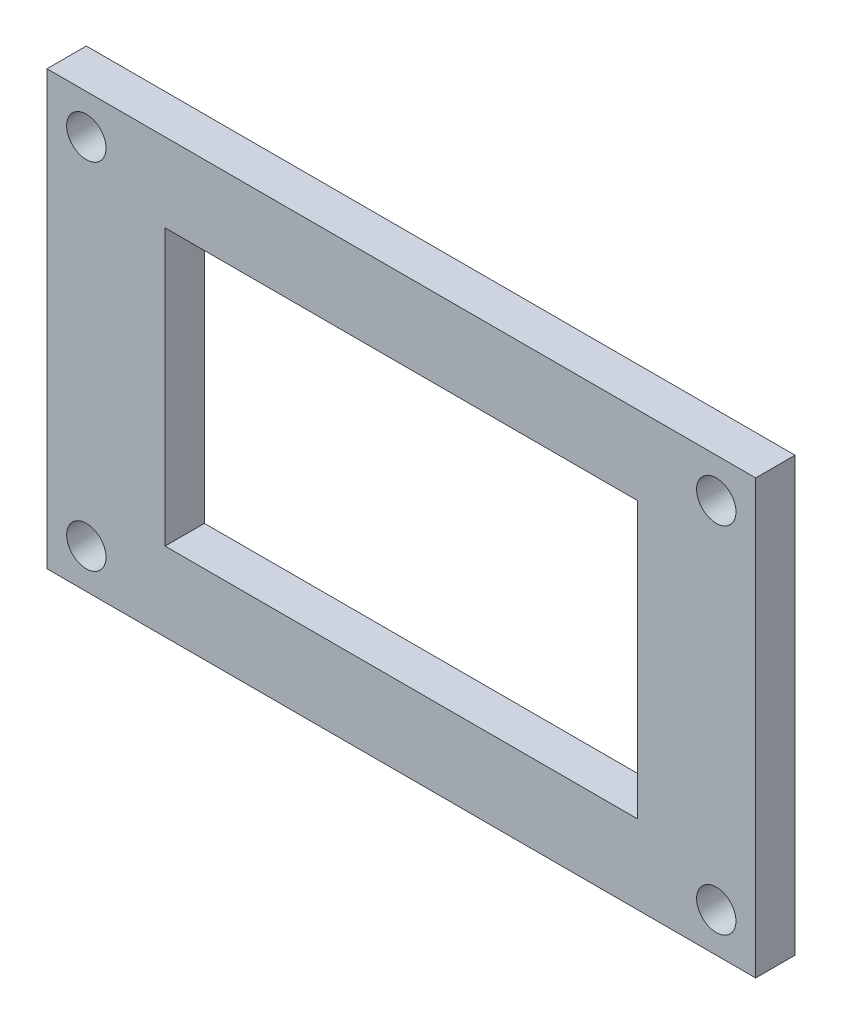
ISO-10303-21;
HEADER;
FILE_DESCRIPTION(('STEP AP214'),'2;1');
FILE_NAME('part.step','',(''),(''),'','','');
FILE_SCHEMA(('AUTOMOTIVE_DESIGN { 1 0 10303 214 1 1 1 1 }'));
ENDSEC;
DATA;
#1=APPLICATION_CONTEXT('core data for automotive mechanical design processes');
#2=APPLICATION_PROTOCOL_DEFINITION('international standard','automotive_design',2000,#1);
#3=PRODUCT_CONTEXT('',#1,'mechanical');
#4=PRODUCT('Part','Part','',(#3));
#5=PRODUCT_RELATED_PRODUCT_CATEGORY('part','',(#4));
#6=PRODUCT_DEFINITION_FORMATION('','',#4);
#7=PRODUCT_DEFINITION_CONTEXT('part definition',#1,'design');
#8=PRODUCT_DEFINITION('design','',#6,#7);
#9=PRODUCT_DEFINITION_SHAPE('','',#8);
#10=(LENGTH_UNIT() NAMED_UNIT(*) SI_UNIT(.MILLI.,.METRE.));
#11=(NAMED_UNIT(*) PLANE_ANGLE_UNIT() SI_UNIT($,.RADIAN.));
#12=(NAMED_UNIT(*) SI_UNIT($,.STERADIAN.) SOLID_ANGLE_UNIT());
#13=UNCERTAINTY_MEASURE_WITH_UNIT(LENGTH_MEASURE(1.E-05),#10,'distance_accuracy_value','');
#14=(GEOMETRIC_REPRESENTATION_CONTEXT(3) GLOBAL_UNCERTAINTY_ASSIGNED_CONTEXT((#13)) GLOBAL_UNIT_ASSIGNED_CONTEXT((#10,
#11,#12)) REPRESENTATION_CONTEXT('',''));
#15=CARTESIAN_POINT('',(0.,0.,0.));
#16=DIRECTION('',(0.,0.,1.));
#17=DIRECTION('',(1.,0.,0.));
#18=AXIS2_PLACEMENT_3D('',#15,#16,#17);
#19=CARTESIAN_POINT('',(0.,0.,3.175));
#20=DIRECTION('',(0.,0.,-1.));
#21=DIRECTION('',(-1.,0.,0.));
#22=AXIS2_PLACEMENT_3D('',#19,#20,#21);
#23=PLANE('',#22);
#24=CARTESIAN_POINT('',(-25.4,-14.2875,3.175));
#25=DIRECTION('',(0.,0.,-1.));
#26=DIRECTION('',(-1.,0.,0.));
#27=AXIS2_PLACEMENT_3D('',#24,#25,#26);
#28=CIRCLE('',#27,1.5875);
#29=CARTESIAN_POINT('',(-26.9875,-14.2875,3.175));
#30=VERTEX_POINT('',#29);
#31=EDGE_CURVE('E251',#30,#30,#28,.T.);
#32=ORIENTED_EDGE('',*,*,#31,.T.);
#33=EDGE_LOOP('',(#32));
#34=FACE_BOUND('',#33,.T.);
#35=CARTESIAN_POINT('',(-25.4,14.2875,3.175));
#36=DIRECTION('',(0.,0.,-1.));
#37=DIRECTION('',(-1.,0.,0.));
#38=AXIS2_PLACEMENT_3D('',#35,#36,#37);
#39=CIRCLE('',#38,1.5875);
#40=CARTESIAN_POINT('',(-26.9875,14.2875,3.175));
#41=VERTEX_POINT('',#40);
#42=EDGE_CURVE('E241',#41,#41,#39,.T.);
#43=ORIENTED_EDGE('',*,*,#42,.T.);
#44=EDGE_LOOP('',(#43));
#45=FACE_BOUND('',#44,.T.);
#46=CARTESIAN_POINT('',(25.4,14.2875,3.175));
#47=DIRECTION('',(0.,0.,-1.));
#48=DIRECTION('',(-1.,0.,0.));
#49=AXIS2_PLACEMENT_3D('',#46,#47,#48);
#50=CIRCLE('',#49,1.5875);
#51=CARTESIAN_POINT('',(23.8125,14.2875,3.175));
#52=VERTEX_POINT('',#51);
#53=EDGE_CURVE('E236',#52,#52,#50,.T.);
#54=ORIENTED_EDGE('',*,*,#53,.T.);
#55=EDGE_LOOP('',(#54));
#56=FACE_BOUND('',#55,.T.);
#57=CARTESIAN_POINT('',(25.4,-14.2875,3.175));
#58=DIRECTION('',(0.,0.,-1.));
#59=DIRECTION('',(-1.,0.,0.));
#60=AXIS2_PLACEMENT_3D('',#57,#58,#59);
#61=CIRCLE('',#60,1.5875);
#62=CARTESIAN_POINT('',(23.8125,-14.2875,3.175));
#63=VERTEX_POINT('',#62);
#64=EDGE_CURVE('E126',#63,#63,#61,.T.);
#65=ORIENTED_EDGE('',*,*,#64,.T.);
#66=EDGE_LOOP('',(#65));
#67=FACE_BOUND('',#66,.T.);
#68=DIRECTION('',(0.,1.,0.));
#69=VECTOR('',#68,1.);
#70=CARTESIAN_POINT('',(28.575,-17.4625,3.175));
#71=LINE('',#70,#69);
#72=CARTESIAN_POINT('',(28.575,-17.4625,3.175));
#73=VERTEX_POINT('',#72);
#74=CARTESIAN_POINT('',(28.575,17.4625,3.175));
#75=VERTEX_POINT('',#74);
#76=EDGE_CURVE('E136',#73,#75,#71,.T.);
#77=ORIENTED_EDGE('',*,*,#76,.T.);
#78=DIRECTION('',(-1.,0.,0.));
#79=VECTOR('',#78,1.);
#80=CARTESIAN_POINT('',(-28.575,17.4625,3.175));
#81=LINE('',#80,#79);
#82=CARTESIAN_POINT('',(-28.575,17.4625,3.175));
#83=VERTEX_POINT('',#82);
#84=EDGE_CURVE('E139',#75,#83,#81,.T.);
#85=ORIENTED_EDGE('',*,*,#84,.T.);
#86=DIRECTION('',(0.,-1.,0.));
#87=VECTOR('',#86,1.);
#88=CARTESIAN_POINT('',(-28.575,-17.4625,3.175));
#89=LINE('',#88,#87);
#90=CARTESIAN_POINT('',(-28.575,-17.4625,3.175));
#91=VERTEX_POINT('',#90);
#92=EDGE_CURVE('E142',#83,#91,#89,.T.);
#93=ORIENTED_EDGE('',*,*,#92,.T.);
#94=DIRECTION('',(1.,0.,0.));
#95=VECTOR('',#94,1.);
#96=CARTESIAN_POINT('',(-28.575,-17.4625,3.175));
#97=LINE('',#96,#95);
#98=EDGE_CURVE('E144',#91,#73,#97,.T.);
#99=ORIENTED_EDGE('',*,*,#98,.T.);
#100=EDGE_LOOP('',(#77,#85,#93,#99));
#101=FACE_BOUND('',#100,.T.);
#102=DIRECTION('',(0.,-1.,0.));
#103=VECTOR('',#102,1.);
#104=CARTESIAN_POINT('',(-19.05,-11.1125,3.175));
#105=LINE('',#104,#103);
#106=CARTESIAN_POINT('',(-19.05,11.1125,3.175));
#107=VERTEX_POINT('',#106);
#108=CARTESIAN_POINT('',(-19.05,-11.1125,3.175));
#109=VERTEX_POINT('',#108);
#110=EDGE_CURVE('E98',#107,#109,#105,.T.);
#111=ORIENTED_EDGE('',*,*,#110,.F.);
#112=DIRECTION('',(-1.,0.,0.));
#113=VECTOR('',#112,1.);
#114=CARTESIAN_POINT('',(19.05,11.1125,3.175));
#115=LINE('',#114,#113);
#116=CARTESIAN_POINT('',(19.05,11.1125,3.175));
#117=VERTEX_POINT('',#116);
#118=EDGE_CURVE('E120',#117,#107,#115,.T.);
#119=ORIENTED_EDGE('',*,*,#118,.F.);
#120=DIRECTION('',(0.,1.,0.));
#121=VECTOR('',#120,1.);
#122=CARTESIAN_POINT('',(19.05,-11.1125,3.175));
#123=LINE('',#122,#121);
#124=CARTESIAN_POINT('',(19.05,-11.1125,3.175));
#125=VERTEX_POINT('',#124);
#126=EDGE_CURVE('E118',#125,#117,#123,.T.);
#127=ORIENTED_EDGE('',*,*,#126,.F.);
#128=DIRECTION('',(1.,0.,0.));
#129=VECTOR('',#128,1.);
#130=CARTESIAN_POINT('',(19.05,-11.1125,3.175));
#131=LINE('',#130,#129);
#132=EDGE_CURVE('E106',#109,#125,#131,.T.);
#133=ORIENTED_EDGE('',*,*,#132,.F.);
#134=EDGE_LOOP('',(#111,#119,#127,#133));
#135=FACE_BOUND('',#134,.T.);
#136=ADVANCED_FACE('F33',(#34,#45,#56,#67,#101,#135),#23,.F.);
#137=CARTESIAN_POINT('',(0.,0.,0.));
#138=DIRECTION('',(0.,0.,-1.));
#139=DIRECTION('',(-1.,0.,0.));
#140=AXIS2_PLACEMENT_3D('',#137,#138,#139);
#141=PLANE('',#140);
#142=CARTESIAN_POINT('',(-25.4,-14.2875,0.));
#143=DIRECTION('',(0.,0.,-1.));
#144=DIRECTION('',(-1.,0.,0.));
#145=AXIS2_PLACEMENT_3D('',#142,#143,#144);
#146=CIRCLE('',#145,1.5875);
#147=CARTESIAN_POINT('',(-26.9875,-14.2875,0.));
#148=VERTEX_POINT('',#147);
#149=EDGE_CURVE('E253',#148,#148,#146,.T.);
#150=ORIENTED_EDGE('',*,*,#149,.F.);
#151=EDGE_LOOP('',(#150));
#152=FACE_BOUND('',#151,.T.);
#153=CARTESIAN_POINT('',(-25.4,14.2875,0.));
#154=DIRECTION('',(0.,0.,-1.));
#155=DIRECTION('',(-1.,0.,0.));
#156=AXIS2_PLACEMENT_3D('',#153,#154,#155);
#157=CIRCLE('',#156,1.5875);
#158=CARTESIAN_POINT('',(-26.9875,14.2875,0.));
#159=VERTEX_POINT('',#158);
#160=EDGE_CURVE('E246',#159,#159,#157,.T.);
#161=ORIENTED_EDGE('',*,*,#160,.F.);
#162=EDGE_LOOP('',(#161));
#163=FACE_BOUND('',#162,.T.);
#164=CARTESIAN_POINT('',(25.4,14.2875,0.));
#165=DIRECTION('',(0.,0.,-1.));
#166=DIRECTION('',(-1.,0.,0.));
#167=AXIS2_PLACEMENT_3D('',#164,#165,#166);
#168=CIRCLE('',#167,1.5875);
#169=CARTESIAN_POINT('',(23.8125,14.2875,0.));
#170=VERTEX_POINT('',#169);
#171=EDGE_CURVE('E239',#170,#170,#168,.T.);
#172=ORIENTED_EDGE('',*,*,#171,.F.);
#173=EDGE_LOOP('',(#172));
#174=FACE_BOUND('',#173,.T.);
#175=CARTESIAN_POINT('',(25.4,-14.2875,0.));
#176=DIRECTION('',(0.,0.,-1.));
#177=DIRECTION('',(-1.,0.,0.));
#178=AXIS2_PLACEMENT_3D('',#175,#176,#177);
#179=CIRCLE('',#178,1.5875);
#180=CARTESIAN_POINT('',(23.8125,-14.2875,0.));
#181=VERTEX_POINT('',#180);
#182=EDGE_CURVE('E243',#181,#181,#179,.T.);
#183=ORIENTED_EDGE('',*,*,#182,.F.);
#184=EDGE_LOOP('',(#183));
#185=FACE_BOUND('',#184,.T.);
#186=DIRECTION('',(0.,1.,0.));
#187=VECTOR('',#186,1.);
#188=CARTESIAN_POINT('',(28.575,-17.4625,0.));
#189=LINE('',#188,#187);
#190=CARTESIAN_POINT('',(28.575,-17.4625,0.));
#191=VERTEX_POINT('',#190);
#192=CARTESIAN_POINT('',(28.575,17.4625,0.));
#193=VERTEX_POINT('',#192);
#194=EDGE_CURVE('E114',#191,#193,#189,.T.);
#195=ORIENTED_EDGE('',*,*,#194,.F.);
#196=DIRECTION('',(1.,0.,0.));
#197=VECTOR('',#196,1.);
#198=CARTESIAN_POINT('',(-28.575,-17.4625,0.));
#199=LINE('',#198,#197);
#200=CARTESIAN_POINT('',(-28.575,-17.4625,0.));
#201=VERTEX_POINT('',#200);
#202=EDGE_CURVE('E140',#201,#191,#199,.T.);
#203=ORIENTED_EDGE('',*,*,#202,.F.);
#204=DIRECTION('',(0.,-1.,0.));
#205=VECTOR('',#204,1.);
#206=CARTESIAN_POINT('',(-28.575,-17.4625,0.));
#207=LINE('',#206,#205);
#208=CARTESIAN_POINT('',(-28.575,17.4625,0.));
#209=VERTEX_POINT('',#208);
#210=EDGE_CURVE('E151',#209,#201,#207,.T.);
#211=ORIENTED_EDGE('',*,*,#210,.F.);
#212=DIRECTION('',(-1.,0.,0.));
#213=VECTOR('',#212,1.);
#214=CARTESIAN_POINT('',(-28.575,17.4625,0.));
#215=LINE('',#214,#213);
#216=EDGE_CURVE('E149',#193,#209,#215,.T.);
#217=ORIENTED_EDGE('',*,*,#216,.F.);
#218=EDGE_LOOP('',(#195,#203,#211,#217));
#219=FACE_BOUND('',#218,.T.);
#220=DIRECTION('',(-1.,0.,0.));
#221=VECTOR('',#220,1.);
#222=CARTESIAN_POINT('',(19.05,11.1125,0.));
#223=LINE('',#222,#221);
#224=CARTESIAN_POINT('',(19.05,11.1125,0.));
#225=VERTEX_POINT('',#224);
#226=CARTESIAN_POINT('',(-19.05,11.1125,0.));
#227=VERTEX_POINT('',#226);
#228=EDGE_CURVE('E107',#225,#227,#223,.T.);
#229=ORIENTED_EDGE('',*,*,#228,.T.);
#230=DIRECTION('',(0.,-1.,0.));
#231=VECTOR('',#230,1.);
#232=CARTESIAN_POINT('',(-19.05,-11.1125,0.));
#233=LINE('',#232,#231);
#234=CARTESIAN_POINT('',(-19.05,-11.1125,0.));
#235=VERTEX_POINT('',#234);
#236=EDGE_CURVE('E56',#227,#235,#233,.T.);
#237=ORIENTED_EDGE('',*,*,#236,.T.);
#238=DIRECTION('',(1.,0.,0.));
#239=VECTOR('',#238,1.);
#240=CARTESIAN_POINT('',(19.05,-11.1125,0.));
#241=LINE('',#240,#239);
#242=CARTESIAN_POINT('',(19.05,-11.1125,0.));
#243=VERTEX_POINT('',#242);
#244=EDGE_CURVE('E113',#235,#243,#241,.T.);
#245=ORIENTED_EDGE('',*,*,#244,.T.);
#246=DIRECTION('',(0.,1.,0.));
#247=VECTOR('',#246,1.);
#248=CARTESIAN_POINT('',(19.05,-11.1125,0.));
#249=LINE('',#248,#247);
#250=EDGE_CURVE('E128',#243,#225,#249,.T.);
#251=ORIENTED_EDGE('',*,*,#250,.T.);
#252=EDGE_LOOP('',(#229,#237,#245,#251));
#253=FACE_BOUND('',#252,.T.);
#254=ADVANCED_FACE('F169',(#152,#163,#174,#185,#219,#253),#141,.T.);
#255=CARTESIAN_POINT('',(28.575,-17.4625,3.175));
#256=DIRECTION('',(-1.,0.,0.));
#257=DIRECTION('',(0.,0.,1.));
#258=AXIS2_PLACEMENT_3D('',#255,#256,#257);
#259=PLANE('',#258);
#260=ORIENTED_EDGE('',*,*,#194,.T.);
#261=DIRECTION('',(0.,0.,-1.));
#262=VECTOR('',#261,1.);
#263=CARTESIAN_POINT('',(28.575,17.4625,3.175));
#264=LINE('',#263,#262);
#265=EDGE_CURVE('E11',#75,#193,#264,.T.);
#266=ORIENTED_EDGE('',*,*,#265,.F.);
#267=ORIENTED_EDGE('',*,*,#76,.F.);
#268=DIRECTION('',(0.,0.,-1.));
#269=VECTOR('',#268,1.);
#270=CARTESIAN_POINT('',(28.575,-17.4625,3.175));
#271=LINE('',#270,#269);
#272=EDGE_CURVE('E146',#73,#191,#271,.T.);
#273=ORIENTED_EDGE('',*,*,#272,.T.);
#274=EDGE_LOOP('',(#260,#266,#267,#273));
#275=FACE_BOUND('',#274,.T.);
#276=ADVANCED_FACE('F35',(#275),#259,.F.);
#277=CARTESIAN_POINT('',(-28.575,17.4625,3.175));
#278=DIRECTION('',(0.,-1.,0.));
#279=DIRECTION('',(0.,0.,-1.));
#280=AXIS2_PLACEMENT_3D('',#277,#278,#279);
#281=PLANE('',#280);
#282=ORIENTED_EDGE('',*,*,#216,.T.);
#283=DIRECTION('',(0.,0.,-1.));
#284=VECTOR('',#283,1.);
#285=CARTESIAN_POINT('',(-28.575,17.4625,3.175));
#286=LINE('',#285,#284);
#287=EDGE_CURVE('E41',#83,#209,#286,.T.);
#288=ORIENTED_EDGE('',*,*,#287,.F.);
#289=ORIENTED_EDGE('',*,*,#84,.F.);
#290=ORIENTED_EDGE('',*,*,#265,.T.);
#291=EDGE_LOOP('',(#282,#288,#289,#290));
#292=FACE_BOUND('',#291,.T.);
#293=ADVANCED_FACE('F179',(#292),#281,.F.);
#294=CARTESIAN_POINT('',(-28.575,-17.4625,3.175));
#295=DIRECTION('',(1.,0.,0.));
#296=DIRECTION('',(0.,0.,-1.));
#297=AXIS2_PLACEMENT_3D('',#294,#295,#296);
#298=PLANE('',#297);
#299=ORIENTED_EDGE('',*,*,#210,.T.);
#300=DIRECTION('',(0.,0.,-1.));
#301=VECTOR('',#300,1.);
#302=CARTESIAN_POINT('',(-28.575,-17.4625,3.175));
#303=LINE('',#302,#301);
#304=EDGE_CURVE('E156',#91,#201,#303,.T.);
#305=ORIENTED_EDGE('',*,*,#304,.F.);
#306=ORIENTED_EDGE('',*,*,#92,.F.);
#307=ORIENTED_EDGE('',*,*,#287,.T.);
#308=EDGE_LOOP('',(#299,#305,#306,#307));
#309=FACE_BOUND('',#308,.T.);
#310=ADVANCED_FACE('F163',(#309),#298,.F.);
#311=CARTESIAN_POINT('',(-28.575,-17.4625,3.175));
#312=DIRECTION('',(0.,1.,0.));
#313=DIRECTION('',(0.,0.,1.));
#314=AXIS2_PLACEMENT_3D('',#311,#312,#313);
#315=PLANE('',#314);
#316=ORIENTED_EDGE('',*,*,#202,.T.);
#317=ORIENTED_EDGE('',*,*,#272,.F.);
#318=ORIENTED_EDGE('',*,*,#98,.F.);
#319=ORIENTED_EDGE('',*,*,#304,.T.);
#320=EDGE_LOOP('',(#316,#317,#318,#319));
#321=FACE_BOUND('',#320,.T.);
#322=ADVANCED_FACE('F173',(#321),#315,.F.);
#323=CARTESIAN_POINT('',(-19.05,-11.1125,3.175));
#324=DIRECTION('',(1.,0.,0.));
#325=DIRECTION('',(0.,0.,-1.));
#326=AXIS2_PLACEMENT_3D('',#323,#324,#325);
#327=PLANE('',#326);
#328=ORIENTED_EDGE('',*,*,#236,.F.);
#329=DIRECTION('',(0.,0.,-1.));
#330=VECTOR('',#329,1.);
#331=CARTESIAN_POINT('',(-19.05,11.1125,3.175));
#332=LINE('',#331,#330);
#333=EDGE_CURVE('E102',#107,#227,#332,.T.);
#334=ORIENTED_EDGE('',*,*,#333,.F.);
#335=ORIENTED_EDGE('',*,*,#110,.T.);
#336=DIRECTION('',(0.,0.,-1.));
#337=VECTOR('',#336,1.);
#338=CARTESIAN_POINT('',(-19.05,-11.1125,3.175));
#339=LINE('',#338,#337);
#340=EDGE_CURVE('E101',#109,#235,#339,.T.);
#341=ORIENTED_EDGE('',*,*,#340,.T.);
#342=EDGE_LOOP('',(#328,#334,#335,#341));
#343=FACE_BOUND('',#342,.T.);
#344=ADVANCED_FACE('F100',(#343),#327,.T.);
#345=CARTESIAN_POINT('',(19.05,-11.1125,3.175));
#346=DIRECTION('',(0.,1.,0.));
#347=DIRECTION('',(-1.,0.,0.));
#348=AXIS2_PLACEMENT_3D('',#345,#346,#347);
#349=PLANE('',#348);
#350=ORIENTED_EDGE('',*,*,#244,.F.);
#351=ORIENTED_EDGE('',*,*,#340,.F.);
#352=ORIENTED_EDGE('',*,*,#132,.T.);
#353=DIRECTION('',(0.,0.,-1.));
#354=VECTOR('',#353,1.);
#355=CARTESIAN_POINT('',(19.05,-11.1125,3.175));
#356=LINE('',#355,#354);
#357=EDGE_CURVE('E115',#125,#243,#356,.T.);
#358=ORIENTED_EDGE('',*,*,#357,.T.);
#359=EDGE_LOOP('',(#350,#351,#352,#358));
#360=FACE_BOUND('',#359,.T.);
#361=ADVANCED_FACE('F110',(#360),#349,.T.);
#362=CARTESIAN_POINT('',(19.05,-11.1125,3.175));
#363=DIRECTION('',(-1.,0.,0.));
#364=DIRECTION('',(0.,0.,1.));
#365=AXIS2_PLACEMENT_3D('',#362,#363,#364);
#366=PLANE('',#365);
#367=ORIENTED_EDGE('',*,*,#250,.F.);
#368=ORIENTED_EDGE('',*,*,#357,.F.);
#369=ORIENTED_EDGE('',*,*,#126,.T.);
#370=DIRECTION('',(0.,0.,-1.));
#371=VECTOR('',#370,1.);
#372=CARTESIAN_POINT('',(19.05,11.1125,3.175));
#373=LINE('',#372,#371);
#374=EDGE_CURVE('E48',#117,#225,#373,.T.);
#375=ORIENTED_EDGE('',*,*,#374,.T.);
#376=EDGE_LOOP('',(#367,#368,#369,#375));
#377=FACE_BOUND('',#376,.T.);
#378=ADVANCED_FACE('F206',(#377),#366,.T.);
#379=CARTESIAN_POINT('',(19.05,11.1125,3.175));
#380=DIRECTION('',(0.,-1.,0.));
#381=DIRECTION('',(1.,0.,0.));
#382=AXIS2_PLACEMENT_3D('',#379,#380,#381);
#383=PLANE('',#382);
#384=ORIENTED_EDGE('',*,*,#228,.F.);
#385=ORIENTED_EDGE('',*,*,#374,.F.);
#386=ORIENTED_EDGE('',*,*,#118,.T.);
#387=ORIENTED_EDGE('',*,*,#333,.T.);
#388=EDGE_LOOP('',(#384,#385,#386,#387));
#389=FACE_BOUND('',#388,.T.);
#390=ADVANCED_FACE('F210',(#389),#383,.T.);
#391=CARTESIAN_POINT('',(25.4,-14.2875,3.175));
#392=DIRECTION('',(0.,0.,-1.));
#393=DIRECTION('',(-1.,0.,0.));
#394=AXIS2_PLACEMENT_3D('',#391,#392,#393);
#395=CYLINDRICAL_SURFACE('',#394,1.5875);
#396=ORIENTED_EDGE('',*,*,#64,.F.);
#397=EDGE_LOOP('',(#396));
#398=FACE_BOUND('',#397,.T.);
#399=ORIENTED_EDGE('',*,*,#182,.T.);
#400=EDGE_LOOP('',(#399));
#401=FACE_BOUND('',#400,.T.);
#402=ADVANCED_FACE('F216',(#398,#401),#395,.F.);
#403=CARTESIAN_POINT('',(25.4,14.2875,3.175));
#404=DIRECTION('',(0.,0.,-1.));
#405=DIRECTION('',(-1.,0.,0.));
#406=AXIS2_PLACEMENT_3D('',#403,#404,#405);
#407=CYLINDRICAL_SURFACE('',#406,1.5875);
#408=ORIENTED_EDGE('',*,*,#53,.F.);
#409=EDGE_LOOP('',(#408));
#410=FACE_BOUND('',#409,.T.);
#411=ORIENTED_EDGE('',*,*,#171,.T.);
#412=EDGE_LOOP('',(#411));
#413=FACE_BOUND('',#412,.T.);
#414=ADVANCED_FACE('F219',(#410,#413),#407,.F.);
#415=CARTESIAN_POINT('',(-25.4,14.2875,3.175));
#416=DIRECTION('',(0.,0.,-1.));
#417=DIRECTION('',(-1.,0.,0.));
#418=AXIS2_PLACEMENT_3D('',#415,#416,#417);
#419=CYLINDRICAL_SURFACE('',#418,1.5875);
#420=ORIENTED_EDGE('',*,*,#42,.F.);
#421=EDGE_LOOP('',(#420));
#422=FACE_BOUND('',#421,.T.);
#423=ORIENTED_EDGE('',*,*,#160,.T.);
#424=EDGE_LOOP('',(#423));
#425=FACE_BOUND('',#424,.T.);
#426=ADVANCED_FACE('F224',(#422,#425),#419,.F.);
#427=CARTESIAN_POINT('',(-25.4,-14.2875,3.175));
#428=DIRECTION('',(0.,0.,-1.));
#429=DIRECTION('',(-1.,0.,0.));
#430=AXIS2_PLACEMENT_3D('',#427,#428,#429);
#431=CYLINDRICAL_SURFACE('',#430,1.5875);
#432=ORIENTED_EDGE('',*,*,#31,.F.);
#433=EDGE_LOOP('',(#432));
#434=FACE_BOUND('',#433,.T.);
#435=ORIENTED_EDGE('',*,*,#149,.T.);
#436=EDGE_LOOP('',(#435));
#437=FACE_BOUND('',#436,.T.);
#438=ADVANCED_FACE('F221',(#434,#437),#431,.F.);
#439=CLOSED_SHELL('',(#136,#254,#276,#293,#310,#322,#344,#361,#378,#390,#402,#414,#426,#438));
#440=MANIFOLD_SOLID_BREP('B2',#439);
#441=ADVANCED_BREP_SHAPE_REPRESENTATION('',(#18,#440),#14);
#442=SHAPE_DEFINITION_REPRESENTATION(#9,#441);
ENDSEC;
END-ISO-10303-21;
